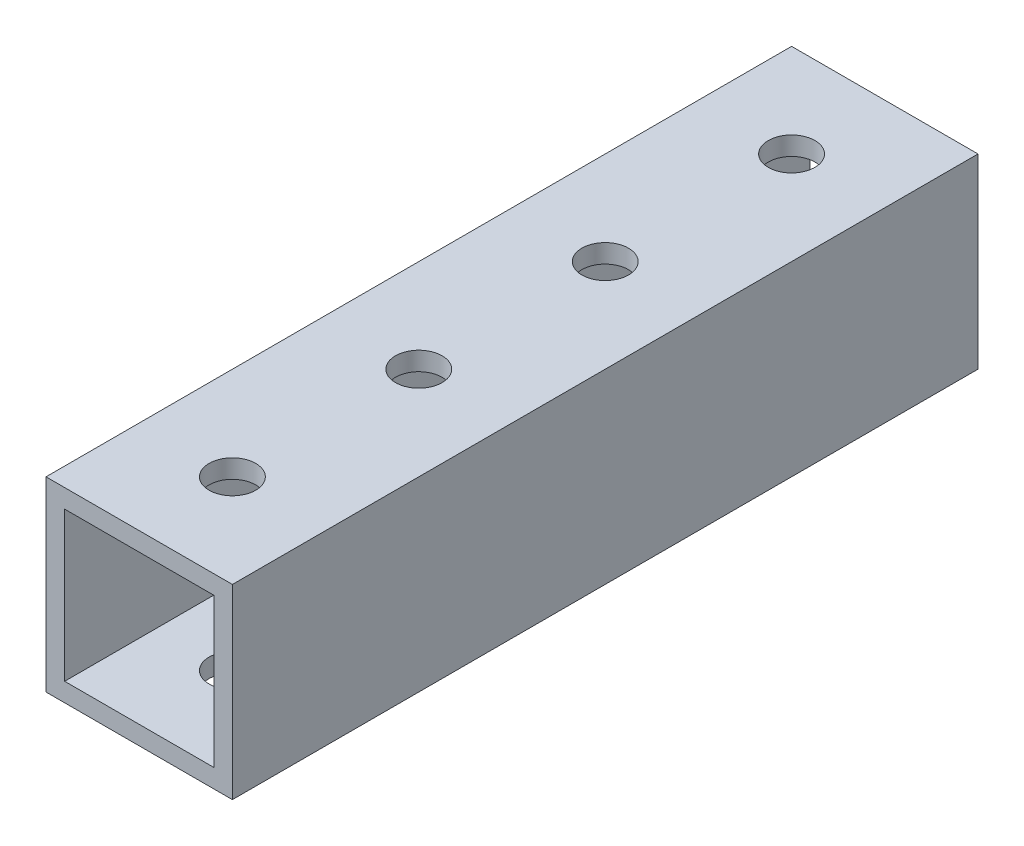
ISO-10303-21;
HEADER;
FILE_DESCRIPTION(('STEP AP214'),'2;1');
FILE_NAME('part.step','',(''),(''),'','','');
FILE_SCHEMA(('AUTOMOTIVE_DESIGN { 1 0 10303 214 1 1 1 1 }'));
ENDSEC;
DATA;
#1=APPLICATION_CONTEXT('core data for automotive mechanical design processes');
#2=APPLICATION_PROTOCOL_DEFINITION('international standard','automotive_design',2000,#1);
#3=PRODUCT_CONTEXT('',#1,'mechanical');
#4=PRODUCT('Part','Part','',(#3));
#5=PRODUCT_RELATED_PRODUCT_CATEGORY('part','',(#4));
#6=PRODUCT_DEFINITION_FORMATION('','',#4);
#7=PRODUCT_DEFINITION_CONTEXT('part definition',#1,'design');
#8=PRODUCT_DEFINITION('design','',#6,#7);
#9=PRODUCT_DEFINITION_SHAPE('','',#8);
#10=(LENGTH_UNIT() NAMED_UNIT(*) SI_UNIT(.MILLI.,.METRE.));
#11=(NAMED_UNIT(*) PLANE_ANGLE_UNIT() SI_UNIT($,.RADIAN.));
#12=(NAMED_UNIT(*) SI_UNIT($,.STERADIAN.) SOLID_ANGLE_UNIT());
#13=UNCERTAINTY_MEASURE_WITH_UNIT(LENGTH_MEASURE(1.E-05),#10,'distance_accuracy_value','');
#14=(GEOMETRIC_REPRESENTATION_CONTEXT(3) GLOBAL_UNCERTAINTY_ASSIGNED_CONTEXT((#13)) GLOBAL_UNIT_ASSIGNED_CONTEXT((#10,
#11,#12)) REPRESENTATION_CONTEXT('',''));
#15=CARTESIAN_POINT('',(0.,0.,0.));
#16=DIRECTION('',(0.,0.,1.));
#17=DIRECTION('',(1.,0.,0.));
#18=AXIS2_PLACEMENT_3D('',#15,#16,#17);
#19=CARTESIAN_POINT('',(0.,0.,80.));
#20=DIRECTION('',(0.,0.,1.));
#21=DIRECTION('',(1.,0.,0.));
#22=AXIS2_PLACEMENT_3D('',#19,#20,#21);
#23=PLANE('',#22);
#24=DIRECTION('',(0.,1.,0.));
#25=VECTOR('',#24,1.);
#26=CARTESIAN_POINT('',(10.,10.,80.));
#27=LINE('',#26,#25);
#28=CARTESIAN_POINT('',(10.,-10.,80.));
#29=VERTEX_POINT('',#28);
#30=CARTESIAN_POINT('',(10.,10.,80.));
#31=VERTEX_POINT('',#30);
#32=EDGE_CURVE('E138',#29,#31,#27,.T.);
#33=ORIENTED_EDGE('',*,*,#32,.T.);
#34=DIRECTION('',(-1.,0.,0.));
#35=VECTOR('',#34,1.);
#36=CARTESIAN_POINT('',(-10.,10.,80.));
#37=LINE('',#36,#35);
#38=CARTESIAN_POINT('',(-10.,10.,80.));
#39=VERTEX_POINT('',#38);
#40=EDGE_CURVE('E141',#31,#39,#37,.T.);
#41=ORIENTED_EDGE('',*,*,#40,.T.);
#42=DIRECTION('',(0.,-1.,0.));
#43=VECTOR('',#42,1.);
#44=CARTESIAN_POINT('',(-10.,10.,80.));
#45=LINE('',#44,#43);
#46=CARTESIAN_POINT('',(-10.,-10.,80.));
#47=VERTEX_POINT('',#46);
#48=EDGE_CURVE('E144',#39,#47,#45,.T.);
#49=ORIENTED_EDGE('',*,*,#48,.T.);
#50=DIRECTION('',(1.,0.,0.));
#51=VECTOR('',#50,1.);
#52=CARTESIAN_POINT('',(-10.,-10.,80.));
#53=LINE('',#52,#51);
#54=EDGE_CURVE('E146',#47,#29,#53,.T.);
#55=ORIENTED_EDGE('',*,*,#54,.T.);
#56=EDGE_LOOP('',(#33,#41,#49,#55));
#57=FACE_BOUND('',#56,.T.);
#58=DIRECTION('',(-1.,0.,0.));
#59=VECTOR('',#58,1.);
#60=CARTESIAN_POINT('',(-8.,8.,80.));
#61=LINE('',#60,#59);
#62=CARTESIAN_POINT('',(8.,8.,80.));
#63=VERTEX_POINT('',#62);
#64=CARTESIAN_POINT('',(-8.,8.,80.));
#65=VERTEX_POINT('',#64);
#66=EDGE_CURVE('E108',#63,#65,#61,.T.);
#67=ORIENTED_EDGE('',*,*,#66,.F.);
#68=DIRECTION('',(0.,1.,0.));
#69=VECTOR('',#68,1.);
#70=CARTESIAN_POINT('',(8.,8.,80.));
#71=LINE('',#70,#69);
#72=CARTESIAN_POINT('',(8.,-8.00000000000001,80.));
#73=VERTEX_POINT('',#72);
#74=EDGE_CURVE('E100',#73,#63,#71,.T.);
#75=ORIENTED_EDGE('',*,*,#74,.F.);
#76=DIRECTION('',(1.,0.,0.));
#77=VECTOR('',#76,1.);
#78=CARTESIAN_POINT('',(-8.,-8.00000000000001,80.));
#79=LINE('',#78,#77);
#80=CARTESIAN_POINT('',(-8.,-8.00000000000001,80.));
#81=VERTEX_POINT('',#80);
#82=EDGE_CURVE('E122',#81,#73,#79,.T.);
#83=ORIENTED_EDGE('',*,*,#82,.F.);
#84=DIRECTION('',(0.,-1.,0.));
#85=VECTOR('',#84,1.);
#86=CARTESIAN_POINT('',(-8.,8.,80.));
#87=LINE('',#86,#85);
#88=EDGE_CURVE('E120',#65,#81,#87,.T.);
#89=ORIENTED_EDGE('',*,*,#88,.F.);
#90=EDGE_LOOP('',(#67,#75,#83,#89));
#91=FACE_BOUND('',#90,.T.);
#92=ADVANCED_FACE('F33',(#57,#91),#23,.T.);
#93=CARTESIAN_POINT('',(0.,0.,0.));
#94=DIRECTION('',(0.,0.,1.));
#95=DIRECTION('',(1.,0.,0.));
#96=AXIS2_PLACEMENT_3D('',#93,#94,#95);
#97=PLANE('',#96);
#98=DIRECTION('',(0.,1.,0.));
#99=VECTOR('',#98,1.);
#100=CARTESIAN_POINT('',(10.,10.,0.));
#101=LINE('',#100,#99);
#102=CARTESIAN_POINT('',(10.,-10.,0.));
#103=VERTEX_POINT('',#102);
#104=CARTESIAN_POINT('',(10.,10.,0.));
#105=VERTEX_POINT('',#104);
#106=EDGE_CURVE('E116',#103,#105,#101,.T.);
#107=ORIENTED_EDGE('',*,*,#106,.F.);
#108=DIRECTION('',(1.,0.,0.));
#109=VECTOR('',#108,1.);
#110=CARTESIAN_POINT('',(-10.,-10.,0.));
#111=LINE('',#110,#109);
#112=CARTESIAN_POINT('',(-10.,-10.,0.));
#113=VERTEX_POINT('',#112);
#114=EDGE_CURVE('E142',#113,#103,#111,.T.);
#115=ORIENTED_EDGE('',*,*,#114,.F.);
#116=DIRECTION('',(0.,-1.,0.));
#117=VECTOR('',#116,1.);
#118=CARTESIAN_POINT('',(-10.,10.,0.));
#119=LINE('',#118,#117);
#120=CARTESIAN_POINT('',(-10.,10.,0.));
#121=VERTEX_POINT('',#120);
#122=EDGE_CURVE('E153',#121,#113,#119,.T.);
#123=ORIENTED_EDGE('',*,*,#122,.F.);
#124=DIRECTION('',(-1.,0.,0.));
#125=VECTOR('',#124,1.);
#126=CARTESIAN_POINT('',(-10.,10.,0.));
#127=LINE('',#126,#125);
#128=EDGE_CURVE('E151',#105,#121,#127,.T.);
#129=ORIENTED_EDGE('',*,*,#128,.F.);
#130=EDGE_LOOP('',(#107,#115,#123,#129));
#131=FACE_BOUND('',#130,.T.);
#132=DIRECTION('',(0.,1.,0.));
#133=VECTOR('',#132,1.);
#134=CARTESIAN_POINT('',(8.,8.,0.));
#135=LINE('',#134,#133);
#136=CARTESIAN_POINT('',(8.,-8.00000000000001,0.));
#137=VERTEX_POINT('',#136);
#138=CARTESIAN_POINT('',(8.,8.,0.));
#139=VERTEX_POINT('',#138);
#140=EDGE_CURVE('E58',#137,#139,#135,.T.);
#141=ORIENTED_EDGE('',*,*,#140,.T.);
#142=DIRECTION('',(-1.,0.,0.));
#143=VECTOR('',#142,1.);
#144=CARTESIAN_POINT('',(-8.,8.,0.));
#145=LINE('',#144,#143);
#146=CARTESIAN_POINT('',(-8.,8.,0.));
#147=VERTEX_POINT('',#146);
#148=EDGE_CURVE('E115',#139,#147,#145,.T.);
#149=ORIENTED_EDGE('',*,*,#148,.T.);
#150=DIRECTION('',(0.,-1.,0.));
#151=VECTOR('',#150,1.);
#152=CARTESIAN_POINT('',(-8.,8.,0.));
#153=LINE('',#152,#151);
#154=CARTESIAN_POINT('',(-8.,-8.00000000000001,0.));
#155=VERTEX_POINT('',#154);
#156=EDGE_CURVE('E130',#147,#155,#153,.T.);
#157=ORIENTED_EDGE('',*,*,#156,.T.);
#158=DIRECTION('',(1.,0.,0.));
#159=VECTOR('',#158,1.);
#160=CARTESIAN_POINT('',(-8.,-8.00000000000001,0.));
#161=LINE('',#160,#159);
#162=EDGE_CURVE('E109',#155,#137,#161,.T.);
#163=ORIENTED_EDGE('',*,*,#162,.T.);
#164=EDGE_LOOP('',(#141,#149,#157,#163));
#165=FACE_BOUND('',#164,.T.);
#166=ADVANCED_FACE('F205',(#131,#165),#97,.F.);
#167=CARTESIAN_POINT('',(10.,10.,80.));
#168=DIRECTION('',(-1.,0.,0.));
#169=DIRECTION('',(0.,0.,1.));
#170=AXIS2_PLACEMENT_3D('',#167,#168,#169);
#171=PLANE('',#170);
#172=ORIENTED_EDGE('',*,*,#106,.T.);
#173=DIRECTION('',(0.,0.,-1.));
#174=VECTOR('',#173,1.);
#175=CARTESIAN_POINT('',(10.,10.,80.));
#176=LINE('',#175,#174);
#177=EDGE_CURVE('E11',#31,#105,#176,.T.);
#178=ORIENTED_EDGE('',*,*,#177,.F.);
#179=ORIENTED_EDGE('',*,*,#32,.F.);
#180=DIRECTION('',(0.,0.,-1.));
#181=VECTOR('',#180,1.);
#182=CARTESIAN_POINT('',(10.,-10.,80.));
#183=LINE('',#182,#181);
#184=EDGE_CURVE('E148',#29,#103,#183,.T.);
#185=ORIENTED_EDGE('',*,*,#184,.T.);
#186=EDGE_LOOP('',(#172,#178,#179,#185));
#187=FACE_BOUND('',#186,.T.);
#188=ADVANCED_FACE('F35',(#187),#171,.F.);
#189=CARTESIAN_POINT('',(-10.,10.,80.));
#190=DIRECTION('',(0.,-1.,0.));
#191=DIRECTION('',(1.,0.,0.));
#192=AXIS2_PLACEMENT_3D('',#189,#190,#191);
#193=PLANE('',#192);
#194=CARTESIAN_POINT('',(0.,10.,10.));
#195=DIRECTION('',(0.,1.,0.));
#196=DIRECTION('',(-1.,0.,0.));
#197=AXIS2_PLACEMENT_3D('',#194,#195,#196);
#198=CIRCLE('',#197,2.5);
#199=CARTESIAN_POINT('',(-2.5,10.,10.));
#200=VERTEX_POINT('',#199);
#201=EDGE_CURVE('E241',#200,#200,#198,.T.);
#202=ORIENTED_EDGE('',*,*,#201,.F.);
#203=EDGE_LOOP('',(#202));
#204=FACE_BOUND('',#203,.T.);
#205=CARTESIAN_POINT('',(0.,10.,30.));
#206=DIRECTION('',(0.,1.,0.));
#207=DIRECTION('',(-1.,0.,0.));
#208=AXIS2_PLACEMENT_3D('',#205,#206,#207);
#209=CIRCLE('',#208,2.5);
#210=CARTESIAN_POINT('',(-2.5,10.,30.));
#211=VERTEX_POINT('',#210);
#212=EDGE_CURVE('E245',#211,#211,#209,.T.);
#213=ORIENTED_EDGE('',*,*,#212,.F.);
#214=EDGE_LOOP('',(#213));
#215=FACE_BOUND('',#214,.T.);
#216=CARTESIAN_POINT('',(0.,10.,50.));
#217=DIRECTION('',(0.,1.,0.));
#218=DIRECTION('',(1.,0.,0.));
#219=AXIS2_PLACEMENT_3D('',#216,#217,#218);
#220=CIRCLE('',#219,2.5);
#221=CARTESIAN_POINT('',(2.50000000000001,10.,50.));
#222=VERTEX_POINT('',#221);
#223=EDGE_CURVE('E249',#222,#222,#220,.T.);
#224=ORIENTED_EDGE('',*,*,#223,.F.);
#225=EDGE_LOOP('',(#224));
#226=FACE_BOUND('',#225,.T.);
#227=CARTESIAN_POINT('',(0.,10.,70.));
#228=DIRECTION('',(0.,1.,0.));
#229=DIRECTION('',(1.,0.,0.));
#230=AXIS2_PLACEMENT_3D('',#227,#228,#229);
#231=CIRCLE('',#230,2.49999999999999);
#232=CARTESIAN_POINT('',(2.5,10.,70.));
#233=VERTEX_POINT('',#232);
#234=EDGE_CURVE('E253',#233,#233,#231,.T.);
#235=ORIENTED_EDGE('',*,*,#234,.F.);
#236=EDGE_LOOP('',(#235));
#237=FACE_BOUND('',#236,.T.);
#238=ORIENTED_EDGE('',*,*,#128,.T.);
#239=DIRECTION('',(0.,0.,-1.));
#240=VECTOR('',#239,1.);
#241=CARTESIAN_POINT('',(-10.,10.,80.));
#242=LINE('',#241,#240);
#243=EDGE_CURVE('E42',#39,#121,#242,.T.);
#244=ORIENTED_EDGE('',*,*,#243,.F.);
#245=ORIENTED_EDGE('',*,*,#40,.F.);
#246=ORIENTED_EDGE('',*,*,#177,.T.);
#247=EDGE_LOOP('',(#238,#244,#245,#246));
#248=FACE_BOUND('',#247,.T.);
#249=ADVANCED_FACE('F230',(#204,#215,#226,#237,#248),#193,.F.);
#250=CARTESIAN_POINT('',(-10.,10.,80.));
#251=DIRECTION('',(1.,0.,0.));
#252=DIRECTION('',(0.,0.,-1.));
#253=AXIS2_PLACEMENT_3D('',#250,#251,#252);
#254=PLANE('',#253);
#255=ORIENTED_EDGE('',*,*,#122,.T.);
#256=DIRECTION('',(0.,0.,-1.));
#257=VECTOR('',#256,1.);
#258=CARTESIAN_POINT('',(-10.,-10.,80.));
#259=LINE('',#258,#257);
#260=EDGE_CURVE('E158',#47,#113,#259,.T.);
#261=ORIENTED_EDGE('',*,*,#260,.F.);
#262=ORIENTED_EDGE('',*,*,#48,.F.);
#263=ORIENTED_EDGE('',*,*,#243,.T.);
#264=EDGE_LOOP('',(#255,#261,#262,#263));
#265=FACE_BOUND('',#264,.T.);
#266=ADVANCED_FACE('F227',(#265),#254,.F.);
#267=CARTESIAN_POINT('',(-10.,-10.,80.));
#268=DIRECTION('',(0.,1.,0.));
#269=DIRECTION('',(0.,0.,1.));
#270=AXIS2_PLACEMENT_3D('',#267,#268,#269);
#271=PLANE('',#270);
#272=CARTESIAN_POINT('',(0.,-10.,10.));
#273=DIRECTION('',(0.,1.,0.));
#274=DIRECTION('',(-1.,0.,0.));
#275=AXIS2_PLACEMENT_3D('',#272,#273,#274);
#276=CIRCLE('',#275,2.5);
#277=CARTESIAN_POINT('',(-2.5,-10.,10.));
#278=VERTEX_POINT('',#277);
#279=EDGE_CURVE('E167',#278,#278,#276,.T.);
#280=ORIENTED_EDGE('',*,*,#279,.T.);
#281=EDGE_LOOP('',(#280));
#282=FACE_BOUND('',#281,.T.);
#283=CARTESIAN_POINT('',(0.,-10.,30.));
#284=DIRECTION('',(0.,1.,0.));
#285=DIRECTION('',(-1.,0.,0.));
#286=AXIS2_PLACEMENT_3D('',#283,#284,#285);
#287=CIRCLE('',#286,2.5);
#288=CARTESIAN_POINT('',(-2.49999999999999,-10.,30.));
#289=VERTEX_POINT('',#288);
#290=EDGE_CURVE('E275',#289,#289,#287,.T.);
#291=ORIENTED_EDGE('',*,*,#290,.T.);
#292=EDGE_LOOP('',(#291));
#293=FACE_BOUND('',#292,.T.);
#294=CARTESIAN_POINT('',(0.,-10.,50.));
#295=DIRECTION('',(0.,1.,0.));
#296=DIRECTION('',(1.,0.,0.));
#297=AXIS2_PLACEMENT_3D('',#294,#295,#296);
#298=CIRCLE('',#297,2.5);
#299=CARTESIAN_POINT('',(2.50000000000001,-10.,50.));
#300=VERTEX_POINT('',#299);
#301=EDGE_CURVE('E271',#300,#300,#298,.T.);
#302=ORIENTED_EDGE('',*,*,#301,.T.);
#303=EDGE_LOOP('',(#302));
#304=FACE_BOUND('',#303,.T.);
#305=CARTESIAN_POINT('',(0.,-10.,70.));
#306=DIRECTION('',(0.,1.,0.));
#307=DIRECTION('',(1.,0.,0.));
#308=AXIS2_PLACEMENT_3D('',#305,#306,#307);
#309=CIRCLE('',#308,2.49999999999999);
#310=CARTESIAN_POINT('',(2.5,-10.,70.));
#311=VERTEX_POINT('',#310);
#312=EDGE_CURVE('E266',#311,#311,#309,.T.);
#313=ORIENTED_EDGE('',*,*,#312,.T.);
#314=EDGE_LOOP('',(#313));
#315=FACE_BOUND('',#314,.T.);
#316=ORIENTED_EDGE('',*,*,#114,.T.);
#317=ORIENTED_EDGE('',*,*,#184,.F.);
#318=ORIENTED_EDGE('',*,*,#54,.F.);
#319=ORIENTED_EDGE('',*,*,#260,.T.);
#320=EDGE_LOOP('',(#316,#317,#318,#319));
#321=FACE_BOUND('',#320,.T.);
#322=ADVANCED_FACE('F224',(#282,#293,#304,#315,#321),#271,.F.);
#323=CARTESIAN_POINT('',(8.,8.,80.));
#324=DIRECTION('',(-1.,0.,0.));
#325=DIRECTION('',(0.,0.,1.));
#326=AXIS2_PLACEMENT_3D('',#323,#324,#325);
#327=PLANE('',#326);
#328=ORIENTED_EDGE('',*,*,#140,.F.);
#329=DIRECTION('',(0.,0.,-1.));
#330=VECTOR('',#329,1.);
#331=CARTESIAN_POINT('',(8.,-8.00000000000001,80.));
#332=LINE('',#331,#330);
#333=EDGE_CURVE('E104',#73,#137,#332,.T.);
#334=ORIENTED_EDGE('',*,*,#333,.F.);
#335=ORIENTED_EDGE('',*,*,#74,.T.);
#336=DIRECTION('',(0.,0.,-1.));
#337=VECTOR('',#336,1.);
#338=CARTESIAN_POINT('',(8.,8.,80.));
#339=LINE('',#338,#337);
#340=EDGE_CURVE('E103',#63,#139,#339,.T.);
#341=ORIENTED_EDGE('',*,*,#340,.T.);
#342=EDGE_LOOP('',(#328,#334,#335,#341));
#343=FACE_BOUND('',#342,.T.);
#344=ADVANCED_FACE('F102',(#343),#327,.T.);
#345=CARTESIAN_POINT('',(-8.,8.,80.));
#346=DIRECTION('',(0.,-1.,0.));
#347=DIRECTION('',(0.,0.,-1.));
#348=AXIS2_PLACEMENT_3D('',#345,#346,#347);
#349=PLANE('',#348);
#350=CARTESIAN_POINT('',(0.,8.00000000000001,10.));
#351=DIRECTION('',(0.,-1.,0.));
#352=DIRECTION('',(0.,0.,-1.));
#353=AXIS2_PLACEMENT_3D('',#350,#351,#352);
#354=CIRCLE('',#353,2.5);
#355=CARTESIAN_POINT('',(0.,8.00000000000001,7.5));
#356=VERTEX_POINT('',#355);
#357=EDGE_CURVE('E128',#356,#356,#354,.T.);
#358=ORIENTED_EDGE('',*,*,#357,.F.);
#359=EDGE_LOOP('',(#358));
#360=FACE_BOUND('',#359,.T.);
#361=CARTESIAN_POINT('',(0.,8.00000000000001,30.));
#362=DIRECTION('',(0.,-1.,0.));
#363=DIRECTION('',(0.,0.,-1.));
#364=AXIS2_PLACEMENT_3D('',#361,#362,#363);
#365=CIRCLE('',#364,2.5);
#366=CARTESIAN_POINT('',(0.,8.00000000000001,27.5));
#367=VERTEX_POINT('',#366);
#368=EDGE_CURVE('E173',#367,#367,#365,.T.);
#369=ORIENTED_EDGE('',*,*,#368,.F.);
#370=EDGE_LOOP('',(#369));
#371=FACE_BOUND('',#370,.T.);
#372=CARTESIAN_POINT('',(0.,8.00000000000001,50.));
#373=DIRECTION('',(0.,-1.,0.));
#374=DIRECTION('',(0.,0.,-1.));
#375=AXIS2_PLACEMENT_3D('',#372,#373,#374);
#376=CIRCLE('',#375,2.5);
#377=CARTESIAN_POINT('',(0.,8.00000000000001,47.5));
#378=VERTEX_POINT('',#377);
#379=EDGE_CURVE('E170',#378,#378,#376,.T.);
#380=ORIENTED_EDGE('',*,*,#379,.F.);
#381=EDGE_LOOP('',(#380));
#382=FACE_BOUND('',#381,.T.);
#383=CARTESIAN_POINT('',(0.,8.00000000000001,70.));
#384=DIRECTION('',(0.,-1.,0.));
#385=DIRECTION('',(0.,0.,-1.));
#386=AXIS2_PLACEMENT_3D('',#383,#384,#385);
#387=CIRCLE('',#386,2.49999999999999);
#388=CARTESIAN_POINT('',(0.,8.00000000000001,67.5));
#389=VERTEX_POINT('',#388);
#390=EDGE_CURVE('E166',#389,#389,#387,.T.);
#391=ORIENTED_EDGE('',*,*,#390,.F.);
#392=EDGE_LOOP('',(#391));
#393=FACE_BOUND('',#392,.T.);
#394=ORIENTED_EDGE('',*,*,#148,.F.);
#395=ORIENTED_EDGE('',*,*,#340,.F.);
#396=ORIENTED_EDGE('',*,*,#66,.T.);
#397=DIRECTION('',(0.,0.,-1.));
#398=VECTOR('',#397,1.);
#399=CARTESIAN_POINT('',(-8.,8.,80.));
#400=LINE('',#399,#398);
#401=EDGE_CURVE('E117',#65,#147,#400,.T.);
#402=ORIENTED_EDGE('',*,*,#401,.T.);
#403=EDGE_LOOP('',(#394,#395,#396,#402));
#404=FACE_BOUND('',#403,.T.);
#405=ADVANCED_FACE('F112',(#360,#371,#382,#393,#404),#349,.T.);
#406=CARTESIAN_POINT('',(-8.,8.,80.));
#407=DIRECTION('',(1.,0.,0.));
#408=DIRECTION('',(0.,0.,-1.));
#409=AXIS2_PLACEMENT_3D('',#406,#407,#408);
#410=PLANE('',#409);
#411=ORIENTED_EDGE('',*,*,#156,.F.);
#412=ORIENTED_EDGE('',*,*,#401,.F.);
#413=ORIENTED_EDGE('',*,*,#88,.T.);
#414=DIRECTION('',(0.,0.,-1.));
#415=VECTOR('',#414,1.);
#416=CARTESIAN_POINT('',(-8.,-8.00000000000001,80.));
#417=LINE('',#416,#415);
#418=EDGE_CURVE('E50',#81,#155,#417,.T.);
#419=ORIENTED_EDGE('',*,*,#418,.T.);
#420=EDGE_LOOP('',(#411,#412,#413,#419));
#421=FACE_BOUND('',#420,.T.);
#422=ADVANCED_FACE('F197',(#421),#410,.T.);
#423=CARTESIAN_POINT('',(-8.,-8.00000000000001,80.));
#424=DIRECTION('',(0.,1.,0.));
#425=DIRECTION('',(0.,0.,1.));
#426=AXIS2_PLACEMENT_3D('',#423,#424,#425);
#427=PLANE('',#426);
#428=CARTESIAN_POINT('',(0.,-8.00000000000001,10.));
#429=DIRECTION('',(0.,1.,0.));
#430=DIRECTION('',(0.,0.,1.));
#431=AXIS2_PLACEMENT_3D('',#428,#429,#430);
#432=CIRCLE('',#431,2.5);
#433=CARTESIAN_POINT('',(0.,-8.00000000000001,12.5));
#434=VERTEX_POINT('',#433);
#435=EDGE_CURVE('E37',#434,#434,#432,.T.);
#436=ORIENTED_EDGE('',*,*,#435,.F.);
#437=EDGE_LOOP('',(#436));
#438=FACE_BOUND('',#437,.T.);
#439=CARTESIAN_POINT('',(0.,-8.00000000000001,30.));
#440=DIRECTION('',(0.,1.,0.));
#441=DIRECTION('',(0.,0.,1.));
#442=AXIS2_PLACEMENT_3D('',#439,#440,#441);
#443=CIRCLE('',#442,2.5);
#444=CARTESIAN_POINT('',(0.,-8.00000000000001,32.5));
#445=VERTEX_POINT('',#444);
#446=EDGE_CURVE('E171',#445,#445,#443,.T.);
#447=ORIENTED_EDGE('',*,*,#446,.F.);
#448=EDGE_LOOP('',(#447));
#449=FACE_BOUND('',#448,.T.);
#450=CARTESIAN_POINT('',(0.,-8.00000000000001,50.));
#451=DIRECTION('',(0.,1.,0.));
#452=DIRECTION('',(0.,0.,1.));
#453=AXIS2_PLACEMENT_3D('',#450,#451,#452);
#454=CIRCLE('',#453,2.5);
#455=CARTESIAN_POINT('',(0.,-8.00000000000001,52.5));
#456=VERTEX_POINT('',#455);
#457=EDGE_CURVE('E168',#456,#456,#454,.T.);
#458=ORIENTED_EDGE('',*,*,#457,.F.);
#459=EDGE_LOOP('',(#458));
#460=FACE_BOUND('',#459,.T.);
#461=CARTESIAN_POINT('',(0.,-8.00000000000001,70.));
#462=DIRECTION('',(0.,1.,0.));
#463=DIRECTION('',(0.,0.,1.));
#464=AXIS2_PLACEMENT_3D('',#461,#462,#463);
#465=CIRCLE('',#464,2.49999999999999);
#466=CARTESIAN_POINT('',(0.,-8.00000000000001,72.5));
#467=VERTEX_POINT('',#466);
#468=EDGE_CURVE('E163',#467,#467,#465,.T.);
#469=ORIENTED_EDGE('',*,*,#468,.F.);
#470=EDGE_LOOP('',(#469));
#471=FACE_BOUND('',#470,.T.);
#472=ORIENTED_EDGE('',*,*,#162,.F.);
#473=ORIENTED_EDGE('',*,*,#418,.F.);
#474=ORIENTED_EDGE('',*,*,#82,.T.);
#475=ORIENTED_EDGE('',*,*,#333,.T.);
#476=EDGE_LOOP('',(#472,#473,#474,#475));
#477=FACE_BOUND('',#476,.T.);
#478=ADVANCED_FACE('F193',(#438,#449,#460,#471,#477),#427,.T.);
#479=CARTESIAN_POINT('',(0.,-10.,70.));
#480=DIRECTION('',(0.,1.,0.));
#481=DIRECTION('',(-1.,0.,0.));
#482=AXIS2_PLACEMENT_3D('',#479,#480,#481);
#483=CYLINDRICAL_SURFACE('',#482,2.49999999999999);
#484=ORIENTED_EDGE('',*,*,#468,.T.);
#485=EDGE_LOOP('',(#484));
#486=FACE_BOUND('',#485,.T.);
#487=ORIENTED_EDGE('',*,*,#312,.F.);
#488=EDGE_LOOP('',(#487));
#489=FACE_BOUND('',#488,.T.);
#490=ADVANCED_FACE('F196',(#486,#489),#483,.F.);
#491=CARTESIAN_POINT('',(0.,-10.,50.));
#492=DIRECTION('',(0.,1.,0.));
#493=DIRECTION('',(-1.,0.,0.));
#494=AXIS2_PLACEMENT_3D('',#491,#492,#493);
#495=CYLINDRICAL_SURFACE('',#494,2.5);
#496=ORIENTED_EDGE('',*,*,#457,.T.);
#497=EDGE_LOOP('',(#496));
#498=FACE_BOUND('',#497,.T.);
#499=ORIENTED_EDGE('',*,*,#301,.F.);
#500=EDGE_LOOP('',(#499));
#501=FACE_BOUND('',#500,.T.);
#502=ADVANCED_FACE('F294',(#498,#501),#495,.F.);
#503=CARTESIAN_POINT('',(0.,-10.,30.));
#504=DIRECTION('',(0.,1.,0.));
#505=DIRECTION('',(-1.,0.,0.));
#506=AXIS2_PLACEMENT_3D('',#503,#504,#505);
#507=CYLINDRICAL_SURFACE('',#506,2.5);
#508=ORIENTED_EDGE('',*,*,#446,.T.);
#509=EDGE_LOOP('',(#508));
#510=FACE_BOUND('',#509,.T.);
#511=ORIENTED_EDGE('',*,*,#290,.F.);
#512=EDGE_LOOP('',(#511));
#513=FACE_BOUND('',#512,.T.);
#514=ADVANCED_FACE('F284',(#510,#513),#507,.F.);
#515=CARTESIAN_POINT('',(0.,-10.,10.));
#516=DIRECTION('',(0.,1.,0.));
#517=DIRECTION('',(-1.,0.,0.));
#518=AXIS2_PLACEMENT_3D('',#515,#516,#517);
#519=CYLINDRICAL_SURFACE('',#518,2.5);
#520=ORIENTED_EDGE('',*,*,#435,.T.);
#521=EDGE_LOOP('',(#520));
#522=FACE_BOUND('',#521,.T.);
#523=ORIENTED_EDGE('',*,*,#279,.F.);
#524=EDGE_LOOP('',(#523));
#525=FACE_BOUND('',#524,.T.);
#526=ADVANCED_FACE('F190',(#522,#525),#519,.F.);
#527=ORIENTED_EDGE('',*,*,#390,.T.);
#528=EDGE_LOOP('',(#527));
#529=FACE_BOUND('',#528,.T.);
#530=ORIENTED_EDGE('',*,*,#234,.T.);
#531=EDGE_LOOP('',(#530));
#532=FACE_BOUND('',#531,.T.);
#533=ADVANCED_FACE('F283',(#529,#532),#483,.F.);
#534=ORIENTED_EDGE('',*,*,#379,.T.);
#535=EDGE_LOOP('',(#534));
#536=FACE_BOUND('',#535,.T.);
#537=ORIENTED_EDGE('',*,*,#223,.T.);
#538=EDGE_LOOP('',(#537));
#539=FACE_BOUND('',#538,.T.);
#540=ADVANCED_FACE('F291',(#536,#539),#495,.F.);
#541=ORIENTED_EDGE('',*,*,#368,.T.);
#542=EDGE_LOOP('',(#541));
#543=FACE_BOUND('',#542,.T.);
#544=ORIENTED_EDGE('',*,*,#212,.T.);
#545=EDGE_LOOP('',(#544));
#546=FACE_BOUND('',#545,.T.);
#547=ADVANCED_FACE('F296',(#543,#546),#507,.F.);
#548=ORIENTED_EDGE('',*,*,#357,.T.);
#549=EDGE_LOOP('',(#548));
#550=FACE_BOUND('',#549,.T.);
#551=ORIENTED_EDGE('',*,*,#201,.T.);
#552=EDGE_LOOP('',(#551));
#553=FACE_BOUND('',#552,.T.);
#554=ADVANCED_FACE('F286',(#550,#553),#519,.F.);
#555=CLOSED_SHELL('',(#92,#166,#188,#249,#266,#322,#344,#405,#422,#478,#490,#502,#514,#526,#533,
#540,#547,#554));
#556=MANIFOLD_SOLID_BREP('B2',#555);
#557=ADVANCED_BREP_SHAPE_REPRESENTATION('',(#18,#556),#14);
#558=SHAPE_DEFINITION_REPRESENTATION(#9,#557);
ENDSEC;
END-ISO-10303-21;
